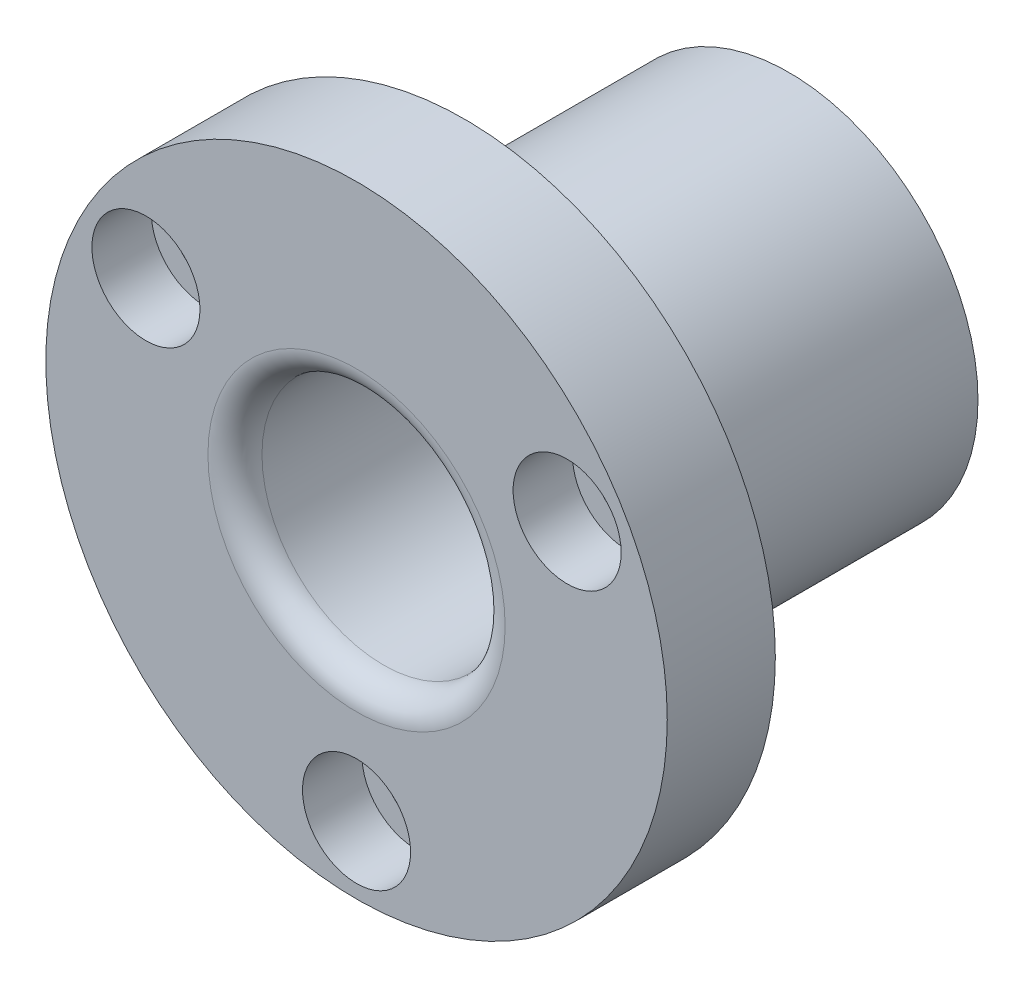
ISO-10303-21;
HEADER;
FILE_DESCRIPTION(('STEP AP214'),'2;1');
FILE_NAME('part.step','',(''),(''),'','','');
FILE_SCHEMA(('AUTOMOTIVE_DESIGN { 1 0 10303 214 1 1 1 1 }'));
ENDSEC;
DATA;
#1=APPLICATION_CONTEXT('core data for automotive mechanical design processes');
#2=APPLICATION_PROTOCOL_DEFINITION('international standard','automotive_design',2000,#1);
#3=PRODUCT_CONTEXT('',#1,'mechanical');
#4=PRODUCT('Part','Part','',(#3));
#5=PRODUCT_RELATED_PRODUCT_CATEGORY('part','',(#4));
#6=PRODUCT_DEFINITION_FORMATION('','',#4);
#7=PRODUCT_DEFINITION_CONTEXT('part definition',#1,'design');
#8=PRODUCT_DEFINITION('design','',#6,#7);
#9=PRODUCT_DEFINITION_SHAPE('','',#8);
#10=(LENGTH_UNIT() NAMED_UNIT(*) SI_UNIT(.MILLI.,.METRE.));
#11=(NAMED_UNIT(*) PLANE_ANGLE_UNIT() SI_UNIT($,.RADIAN.));
#12=(NAMED_UNIT(*) SI_UNIT($,.STERADIAN.) SOLID_ANGLE_UNIT());
#13=UNCERTAINTY_MEASURE_WITH_UNIT(LENGTH_MEASURE(1.E-05),#10,'distance_accuracy_value','');
#14=(GEOMETRIC_REPRESENTATION_CONTEXT(3) GLOBAL_UNCERTAINTY_ASSIGNED_CONTEXT((#13)) GLOBAL_UNIT_ASSIGNED_CONTEXT((#10,
#11,#12)) REPRESENTATION_CONTEXT('',''));
#15=CARTESIAN_POINT('',(0.,0.,0.));
#16=DIRECTION('',(0.,0.,1.));
#17=DIRECTION('',(1.,0.,0.));
#18=AXIS2_PLACEMENT_3D('',#15,#16,#17);
#19=CARTESIAN_POINT('',(0.,0.,24.));
#20=DIRECTION('',(0.,0.,-1.));
#21=DIRECTION('',(-1.,0.,0.));
#22=AXIS2_PLACEMENT_3D('',#19,#20,#21);
#23=CYLINDRICAL_SURFACE('',#22,14.);
#24=CARTESIAN_POINT('',(0.,0.,23.));
#25=DIRECTION('',(0.,0.,1.));
#26=DIRECTION('',(1.,0.,0.));
#27=AXIS2_PLACEMENT_3D('',#24,#25,#26);
#28=CIRCLE('',#27,14.);
#29=CARTESIAN_POINT('',(14.,0.,23.));
#30=VERTEX_POINT('',#29);
#31=EDGE_CURVE('E10',#30,#30,#28,.F.);
#32=ORIENTED_EDGE('',*,*,#31,.T.);
#33=EDGE_LOOP('',(#32));
#34=FACE_BOUND('',#33,.T.);
#35=CARTESIAN_POINT('',(0.,0.,0.));
#36=DIRECTION('',(0.,0.,1.));
#37=DIRECTION('',(1.,0.,0.));
#38=AXIS2_PLACEMENT_3D('',#35,#36,#37);
#39=CIRCLE('',#38,14.);
#40=CARTESIAN_POINT('',(14.,0.,0.));
#41=VERTEX_POINT('',#40);
#42=EDGE_CURVE('E73',#41,#41,#39,.T.);
#43=ORIENTED_EDGE('',*,*,#42,.T.);
#44=EDGE_LOOP('',(#43));
#45=FACE_BOUND('',#44,.T.);
#46=ADVANCED_FACE('F51',(#34,#45),#23,.T.);
#47=CARTESIAN_POINT('',(0.,0.,0.));
#48=DIRECTION('',(0.,0.,1.));
#49=DIRECTION('',(1.,0.,0.));
#50=AXIS2_PLACEMENT_3D('',#47,#48,#49);
#51=PLANE('',#50);
#52=CARTESIAN_POINT('',(0.,0.,0.));
#53=DIRECTION('',(0.,0.,1.));
#54=DIRECTION('',(1.,0.,0.));
#55=AXIS2_PLACEMENT_3D('',#52,#53,#54);
#56=CIRCLE('',#55,9.);
#57=CARTESIAN_POINT('',(9.,0.,0.));
#58=VERTEX_POINT('',#57);
#59=EDGE_CURVE('E90',#58,#58,#56,.T.);
#60=ORIENTED_EDGE('',*,*,#59,.T.);
#61=EDGE_LOOP('',(#60));
#62=FACE_BOUND('',#61,.T.);
#63=ORIENTED_EDGE('',*,*,#42,.F.);
#64=EDGE_LOOP('',(#63));
#65=FACE_BOUND('',#64,.T.);
#66=ADVANCED_FACE('F145',(#62,#65),#51,.F.);
#67=CARTESIAN_POINT('',(0.,0.,32.));
#68=DIRECTION('',(0.,0.,1.));
#69=DIRECTION('',(1.,0.,0.));
#70=AXIS2_PLACEMENT_3D('',#67,#68,#69);
#71=PLANE('',#70);
#72=CARTESIAN_POINT('',(0.,0.,32.));
#73=DIRECTION('',(0.,0.,1.));
#74=DIRECTION('',(1.,0.,0.));
#75=AXIS2_PLACEMENT_3D('',#72,#73,#74);
#76=CIRCLE('',#75,11.);
#77=CARTESIAN_POINT('',(11.,0.,32.));
#78=VERTEX_POINT('',#77);
#79=EDGE_CURVE('E62',#78,#78,#76,.F.);
#80=ORIENTED_EDGE('',*,*,#79,.T.);
#81=EDGE_LOOP('',(#80));
#82=FACE_BOUND('',#81,.T.);
#83=CARTESIAN_POINT('',(-15.58845726812,8.99999999999985,32.));
#84=DIRECTION('',(0.,0.,1.));
#85=DIRECTION('',(1.,0.,0.));
#86=AXIS2_PLACEMENT_3D('',#83,#84,#85);
#87=CIRCLE('',#86,3.99999999999999);
#88=CARTESIAN_POINT('',(-11.58845726812,8.99999999999985,32.));
#89=VERTEX_POINT('',#88);
#90=EDGE_CURVE('E133',#89,#89,#87,.T.);
#91=ORIENTED_EDGE('',*,*,#90,.F.);
#92=EDGE_LOOP('',(#91));
#93=FACE_BOUND('',#92,.T.);
#94=CARTESIAN_POINT('',(15.5884572681199,9.00000000000007,32.));
#95=DIRECTION('',(0.,0.,1.));
#96=DIRECTION('',(1.,0.,0.));
#97=AXIS2_PLACEMENT_3D('',#94,#95,#96);
#98=CIRCLE('',#97,3.99999999999999);
#99=CARTESIAN_POINT('',(19.5884572681198,9.00000000000007,32.));
#100=VERTEX_POINT('',#99);
#101=EDGE_CURVE('E78',#100,#100,#98,.T.);
#102=ORIENTED_EDGE('',*,*,#101,.F.);
#103=EDGE_LOOP('',(#102));
#104=FACE_BOUND('',#103,.T.);
#105=CARTESIAN_POINT('',(0.,-18.,32.));
#106=DIRECTION('',(0.,0.,1.));
#107=DIRECTION('',(1.,0.,0.));
#108=AXIS2_PLACEMENT_3D('',#105,#106,#107);
#109=CIRCLE('',#108,3.99999999999999);
#110=CARTESIAN_POINT('',(3.99999999999999,-18.,32.));
#111=VERTEX_POINT('',#110);
#112=EDGE_CURVE('E84',#111,#111,#109,.T.);
#113=ORIENTED_EDGE('',*,*,#112,.F.);
#114=EDGE_LOOP('',(#113));
#115=FACE_BOUND('',#114,.T.);
#116=CARTESIAN_POINT('',(0.,0.,32.));
#117=DIRECTION('',(0.,0.,1.));
#118=DIRECTION('',(1.,0.,0.));
#119=AXIS2_PLACEMENT_3D('',#116,#117,#118);
#120=CIRCLE('',#119,23.);
#121=CARTESIAN_POINT('',(23.,0.,32.));
#122=VERTEX_POINT('',#121);
#123=EDGE_CURVE('E95',#122,#122,#120,.T.);
#124=ORIENTED_EDGE('',*,*,#123,.T.);
#125=EDGE_LOOP('',(#124));
#126=FACE_BOUND('',#125,.T.);
#127=ADVANCED_FACE('F141',(#82,#93,#104,#115,#126),#71,.T.);
#128=CARTESIAN_POINT('',(0.,0.,24.));
#129=DIRECTION('',(0.,0.,1.));
#130=DIRECTION('',(1.,0.,0.));
#131=AXIS2_PLACEMENT_3D('',#128,#129,#130);
#132=PLANE('',#131);
#133=CARTESIAN_POINT('',(0.,0.,24.));
#134=DIRECTION('',(0.,0.,1.));
#135=DIRECTION('',(1.,0.,0.));
#136=AXIS2_PLACEMENT_3D('',#133,#134,#135);
#137=CIRCLE('',#136,15.);
#138=CARTESIAN_POINT('',(15.,0.,24.));
#139=VERTEX_POINT('',#138);
#140=EDGE_CURVE('E58',#139,#139,#137,.T.);
#141=ORIENTED_EDGE('',*,*,#140,.T.);
#142=EDGE_LOOP('',(#141));
#143=FACE_BOUND('',#142,.T.);
#144=CARTESIAN_POINT('',(-15.58845726812,8.99999999999985,24.));
#145=DIRECTION('',(0.,0.,1.));
#146=DIRECTION('',(1.,0.,0.));
#147=AXIS2_PLACEMENT_3D('',#144,#145,#146);
#148=CIRCLE('',#147,2.24999999999999);
#149=CARTESIAN_POINT('',(-13.33845726812,8.99999999999985,24.));
#150=VERTEX_POINT('',#149);
#151=EDGE_CURVE('E74',#150,#150,#148,.T.);
#152=ORIENTED_EDGE('',*,*,#151,.T.);
#153=EDGE_LOOP('',(#152));
#154=FACE_BOUND('',#153,.T.);
#155=CARTESIAN_POINT('',(15.5884572681199,9.00000000000007,24.));
#156=DIRECTION('',(0.,0.,1.));
#157=DIRECTION('',(1.,0.,0.));
#158=AXIS2_PLACEMENT_3D('',#155,#156,#157);
#159=CIRCLE('',#158,2.24999999999999);
#160=CARTESIAN_POINT('',(17.8384572681198,9.00000000000007,24.));
#161=VERTEX_POINT('',#160);
#162=EDGE_CURVE('E80',#161,#161,#159,.T.);
#163=ORIENTED_EDGE('',*,*,#162,.T.);
#164=EDGE_LOOP('',(#163));
#165=FACE_BOUND('',#164,.T.);
#166=CARTESIAN_POINT('',(0.,-18.,24.));
#167=DIRECTION('',(0.,0.,1.));
#168=DIRECTION('',(1.,0.,0.));
#169=AXIS2_PLACEMENT_3D('',#166,#167,#168);
#170=CIRCLE('',#169,2.24999999999999);
#171=CARTESIAN_POINT('',(2.24999999999999,-18.,24.));
#172=VERTEX_POINT('',#171);
#173=EDGE_CURVE('E86',#172,#172,#170,.T.);
#174=ORIENTED_EDGE('',*,*,#173,.T.);
#175=EDGE_LOOP('',(#174));
#176=FACE_BOUND('',#175,.T.);
#177=CARTESIAN_POINT('',(0.,0.,24.));
#178=DIRECTION('',(0.,0.,1.));
#179=DIRECTION('',(1.,0.,0.));
#180=AXIS2_PLACEMENT_3D('',#177,#178,#179);
#181=CIRCLE('',#180,23.);
#182=CARTESIAN_POINT('',(23.,0.,24.));
#183=VERTEX_POINT('',#182);
#184=EDGE_CURVE('E96',#183,#183,#181,.T.);
#185=ORIENTED_EDGE('',*,*,#184,.F.);
#186=EDGE_LOOP('',(#185));
#187=FACE_BOUND('',#186,.T.);
#188=ADVANCED_FACE('F144',(#143,#154,#165,#176,#187),#132,.F.);
#189=CARTESIAN_POINT('',(0.,0.,32.));
#190=DIRECTION('',(0.,0.,-1.));
#191=DIRECTION('',(-1.,0.,0.));
#192=AXIS2_PLACEMENT_3D('',#189,#190,#191);
#193=CYLINDRICAL_SURFACE('',#192,23.);
#194=ORIENTED_EDGE('',*,*,#123,.F.);
#195=EDGE_LOOP('',(#194));
#196=FACE_BOUND('',#195,.T.);
#197=ORIENTED_EDGE('',*,*,#184,.T.);
#198=EDGE_LOOP('',(#197));
#199=FACE_BOUND('',#198,.T.);
#200=ADVANCED_FACE('F154',(#196,#199),#193,.T.);
#201=CARTESIAN_POINT('',(0.,0.,32.));
#202=DIRECTION('',(0.,0.,-1.));
#203=DIRECTION('',(-1.,0.,0.));
#204=AXIS2_PLACEMENT_3D('',#201,#202,#203);
#205=CYLINDRICAL_SURFACE('',#204,9.);
#206=CARTESIAN_POINT('',(0.,0.,30.));
#207=DIRECTION('',(0.,0.,1.));
#208=DIRECTION('',(1.,0.,0.));
#209=AXIS2_PLACEMENT_3D('',#206,#207,#208);
#210=CIRCLE('',#209,9.);
#211=CARTESIAN_POINT('',(9.,0.,30.));
#212=VERTEX_POINT('',#211);
#213=EDGE_CURVE('E67',#212,#212,#210,.T.);
#214=ORIENTED_EDGE('',*,*,#213,.T.);
#215=EDGE_LOOP('',(#214));
#216=FACE_BOUND('',#215,.T.);
#217=ORIENTED_EDGE('',*,*,#59,.F.);
#218=EDGE_LOOP('',(#217));
#219=FACE_BOUND('',#218,.T.);
#220=ADVANCED_FACE('F157',(#216,#219),#205,.F.);
#221=CARTESIAN_POINT('',(0.,-18.,32.));
#222=DIRECTION('',(0.,0.,1.));
#223=DIRECTION('',(1.,0.,0.));
#224=AXIS2_PLACEMENT_3D('',#221,#222,#223);
#225=CYLINDRICAL_SURFACE('',#224,2.24999999999999);
#226=CARTESIAN_POINT('',(0.,-18.,27.6));
#227=DIRECTION('',(0.,0.,1.));
#228=DIRECTION('',(1.,0.,0.));
#229=AXIS2_PLACEMENT_3D('',#226,#227,#228);
#230=CIRCLE('',#229,2.25);
#231=CARTESIAN_POINT('',(2.25,-18.,27.6));
#232=VERTEX_POINT('',#231);
#233=EDGE_CURVE('E91',#232,#232,#230,.T.);
#234=ORIENTED_EDGE('',*,*,#233,.T.);
#235=EDGE_LOOP('',(#234));
#236=FACE_BOUND('',#235,.T.);
#237=ORIENTED_EDGE('',*,*,#173,.F.);
#238=EDGE_LOOP('',(#237));
#239=FACE_BOUND('',#238,.T.);
#240=ADVANCED_FACE('F191',(#236,#239),#225,.F.);
#241=CARTESIAN_POINT('',(2.25,-18.,27.6));
#242=DIRECTION('',(0.,0.,-1.));
#243=DIRECTION('',(-1.,0.,0.));
#244=AXIS2_PLACEMENT_3D('',#241,#242,#243);
#245=PLANE('',#244);
#246=ORIENTED_EDGE('',*,*,#233,.F.);
#247=EDGE_LOOP('',(#246));
#248=FACE_BOUND('',#247,.T.);
#249=CARTESIAN_POINT('',(0.,-18.,27.6));
#250=DIRECTION('',(0.,0.,1.));
#251=DIRECTION('',(1.,0.,0.));
#252=AXIS2_PLACEMENT_3D('',#249,#250,#251);
#253=CIRCLE('',#252,4.);
#254=CARTESIAN_POINT('',(4.,-18.,27.6));
#255=VERTEX_POINT('',#254);
#256=EDGE_CURVE('E109',#255,#255,#253,.T.);
#257=ORIENTED_EDGE('',*,*,#256,.T.);
#258=EDGE_LOOP('',(#257));
#259=FACE_BOUND('',#258,.T.);
#260=ADVANCED_FACE('F199',(#248,#259),#245,.F.);
#261=CARTESIAN_POINT('',(0.,-18.,32.));
#262=DIRECTION('',(0.,0.,1.));
#263=DIRECTION('',(1.,0.,0.));
#264=AXIS2_PLACEMENT_3D('',#261,#262,#263);
#265=CYLINDRICAL_SURFACE('',#264,3.99999999999999);
#266=ORIENTED_EDGE('',*,*,#256,.F.);
#267=EDGE_LOOP('',(#266));
#268=FACE_BOUND('',#267,.T.);
#269=ORIENTED_EDGE('',*,*,#112,.T.);
#270=EDGE_LOOP('',(#269));
#271=FACE_BOUND('',#270,.T.);
#272=ADVANCED_FACE('F205',(#268,#271),#265,.F.);
#273=CARTESIAN_POINT('',(15.5884572681199,9.00000000000007,32.));
#274=DIRECTION('',(0.,0.,1.));
#275=DIRECTION('',(1.,0.,0.));
#276=AXIS2_PLACEMENT_3D('',#273,#274,#275);
#277=CYLINDRICAL_SURFACE('',#276,2.24999999999999);
#278=CARTESIAN_POINT('',(15.5884572681199,9.00000000000007,27.6));
#279=DIRECTION('',(0.,0.,1.));
#280=DIRECTION('',(1.,0.,0.));
#281=AXIS2_PLACEMENT_3D('',#278,#279,#280);
#282=CIRCLE('',#281,2.25);
#283=CARTESIAN_POINT('',(17.8384572681199,9.00000000000007,27.6));
#284=VERTEX_POINT('',#283);
#285=EDGE_CURVE('E85',#284,#284,#282,.T.);
#286=ORIENTED_EDGE('',*,*,#285,.T.);
#287=EDGE_LOOP('',(#286));
#288=FACE_BOUND('',#287,.T.);
#289=ORIENTED_EDGE('',*,*,#162,.F.);
#290=EDGE_LOOP('',(#289));
#291=FACE_BOUND('',#290,.T.);
#292=ADVANCED_FACE('F209',(#288,#291),#277,.F.);
#293=CARTESIAN_POINT('',(17.8384572681199,9.00000000000007,27.6));
#294=DIRECTION('',(0.,0.,-1.));
#295=DIRECTION('',(-1.,0.,0.));
#296=AXIS2_PLACEMENT_3D('',#293,#294,#295);
#297=PLANE('',#296);
#298=ORIENTED_EDGE('',*,*,#285,.F.);
#299=EDGE_LOOP('',(#298));
#300=FACE_BOUND('',#299,.T.);
#301=CARTESIAN_POINT('',(15.5884572681199,9.00000000000007,27.6));
#302=DIRECTION('',(0.,0.,1.));
#303=DIRECTION('',(1.,0.,0.));
#304=AXIS2_PLACEMENT_3D('',#301,#302,#303);
#305=CIRCLE('',#304,4.);
#306=CARTESIAN_POINT('',(19.5884572681199,9.00000000000007,27.6));
#307=VERTEX_POINT('',#306);
#308=EDGE_CURVE('E119',#307,#307,#305,.T.);
#309=ORIENTED_EDGE('',*,*,#308,.T.);
#310=EDGE_LOOP('',(#309));
#311=FACE_BOUND('',#310,.T.);
#312=ADVANCED_FACE('F213',(#300,#311),#297,.F.);
#313=CARTESIAN_POINT('',(15.5884572681199,9.00000000000007,32.));
#314=DIRECTION('',(0.,0.,1.));
#315=DIRECTION('',(1.,0.,0.));
#316=AXIS2_PLACEMENT_3D('',#313,#314,#315);
#317=CYLINDRICAL_SURFACE('',#316,3.99999999999999);
#318=ORIENTED_EDGE('',*,*,#308,.F.);
#319=EDGE_LOOP('',(#318));
#320=FACE_BOUND('',#319,.T.);
#321=ORIENTED_EDGE('',*,*,#101,.T.);
#322=EDGE_LOOP('',(#321));
#323=FACE_BOUND('',#322,.T.);
#324=ADVANCED_FACE('F217',(#320,#323),#317,.F.);
#325=CARTESIAN_POINT('',(-15.58845726812,8.99999999999985,32.));
#326=DIRECTION('',(0.,0.,1.));
#327=DIRECTION('',(1.,0.,0.));
#328=AXIS2_PLACEMENT_3D('',#325,#326,#327);
#329=CYLINDRICAL_SURFACE('',#328,2.24999999999999);
#330=CARTESIAN_POINT('',(-15.58845726812,8.99999999999985,27.6));
#331=DIRECTION('',(0.,0.,1.));
#332=DIRECTION('',(1.,0.,0.));
#333=AXIS2_PLACEMENT_3D('',#330,#331,#332);
#334=CIRCLE('',#333,2.25);
#335=CARTESIAN_POINT('',(-13.33845726812,8.99999999999985,27.6));
#336=VERTEX_POINT('',#335);
#337=EDGE_CURVE('E79',#336,#336,#334,.T.);
#338=ORIENTED_EDGE('',*,*,#337,.T.);
#339=EDGE_LOOP('',(#338));
#340=FACE_BOUND('',#339,.T.);
#341=ORIENTED_EDGE('',*,*,#151,.F.);
#342=EDGE_LOOP('',(#341));
#343=FACE_BOUND('',#342,.T.);
#344=ADVANCED_FACE('F221',(#340,#343),#329,.F.);
#345=CARTESIAN_POINT('',(-13.33845726812,8.99999999999985,27.6));
#346=DIRECTION('',(0.,0.,-1.));
#347=DIRECTION('',(-1.,0.,0.));
#348=AXIS2_PLACEMENT_3D('',#345,#346,#347);
#349=PLANE('',#348);
#350=ORIENTED_EDGE('',*,*,#337,.F.);
#351=EDGE_LOOP('',(#350));
#352=FACE_BOUND('',#351,.T.);
#353=CARTESIAN_POINT('',(-15.58845726812,8.99999999999985,27.6));
#354=DIRECTION('',(0.,0.,1.));
#355=DIRECTION('',(1.,0.,0.));
#356=AXIS2_PLACEMENT_3D('',#353,#354,#355);
#357=CIRCLE('',#356,4.);
#358=CARTESIAN_POINT('',(-11.58845726812,8.99999999999985,27.6));
#359=VERTEX_POINT('',#358);
#360=EDGE_CURVE('E129',#359,#359,#357,.T.);
#361=ORIENTED_EDGE('',*,*,#360,.T.);
#362=EDGE_LOOP('',(#361));
#363=FACE_BOUND('',#362,.T.);
#364=ADVANCED_FACE('F183',(#352,#363),#349,.F.);
#365=CARTESIAN_POINT('',(-15.58845726812,8.99999999999985,32.));
#366=DIRECTION('',(0.,0.,1.));
#367=DIRECTION('',(1.,0.,0.));
#368=AXIS2_PLACEMENT_3D('',#365,#366,#367);
#369=CYLINDRICAL_SURFACE('',#368,3.99999999999999);
#370=ORIENTED_EDGE('',*,*,#360,.F.);
#371=EDGE_LOOP('',(#370));
#372=FACE_BOUND('',#371,.T.);
#373=ORIENTED_EDGE('',*,*,#90,.T.);
#374=EDGE_LOOP('',(#373));
#375=FACE_BOUND('',#374,.T.);
#376=ADVANCED_FACE('F139',(#372,#375),#369,.F.);
#377=CARTESIAN_POINT('',(0.,0.,30.));
#378=DIRECTION('',(0.,0.,1.));
#379=DIRECTION('',(1.,0.,0.));
#380=AXIS2_PLACEMENT_3D('',#377,#378,#379);
#381=TOROIDAL_SURFACE('',#380,11.,2.);
#382=ORIENTED_EDGE('',*,*,#79,.F.);
#383=EDGE_LOOP('',(#382));
#384=FACE_BOUND('',#383,.T.);
#385=ORIENTED_EDGE('',*,*,#213,.F.);
#386=EDGE_LOOP('',(#385));
#387=FACE_BOUND('',#386,.T.);
#388=ADVANCED_FACE('F176',(#384,#387),#381,.T.);
#389=CARTESIAN_POINT('',(0.,0.,23.));
#390=DIRECTION('',(0.,0.,1.));
#391=DIRECTION('',(1.,0.,0.));
#392=AXIS2_PLACEMENT_3D('',#389,#390,#391);
#393=TOROIDAL_SURFACE('',#392,15.,1.);
#394=ORIENTED_EDGE('',*,*,#31,.F.);
#395=EDGE_LOOP('',(#394));
#396=FACE_BOUND('',#395,.T.);
#397=ORIENTED_EDGE('',*,*,#140,.F.);
#398=EDGE_LOOP('',(#397));
#399=FACE_BOUND('',#398,.T.);
#400=ADVANCED_FACE('F53',(#396,#399),#393,.F.);
#401=CLOSED_SHELL('',(#46,#66,#127,#188,#200,#220,#240,#260,#272,#292,#312,#324,#344,#364,#376,
#388,#400));
#402=MANIFOLD_SOLID_BREP('B2',#401);
#403=ADVANCED_BREP_SHAPE_REPRESENTATION('',(#18,#402),#14);
#404=SHAPE_DEFINITION_REPRESENTATION(#9,#403);
ENDSEC;
END-ISO-10303-21;
